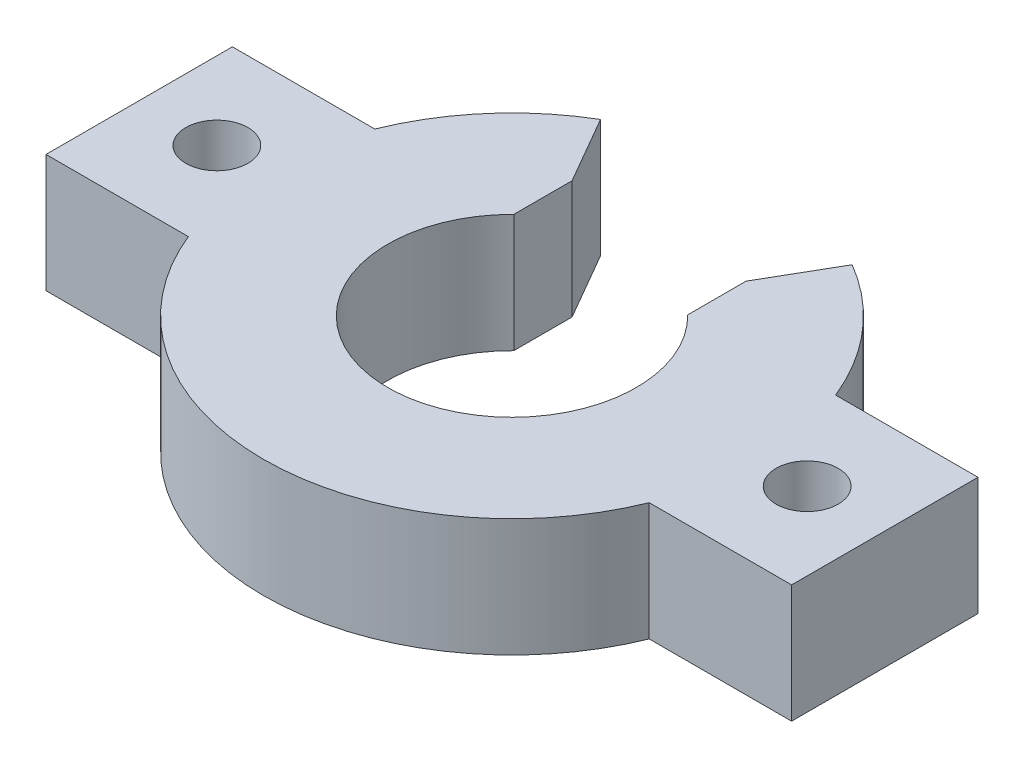
ISO-10303-21;
HEADER;
FILE_DESCRIPTION(('STEP AP214'),'2;1');
FILE_NAME('part.step','',(''),(''),'','','');
FILE_SCHEMA(('AUTOMOTIVE_DESIGN { 1 0 10303 214 1 1 1 1 }'));
ENDSEC;
DATA;
#1=APPLICATION_CONTEXT('core data for automotive mechanical design processes');
#2=APPLICATION_PROTOCOL_DEFINITION('international standard','automotive_design',2000,#1);
#3=PRODUCT_CONTEXT('',#1,'mechanical');
#4=PRODUCT('Part','Part','',(#3));
#5=PRODUCT_RELATED_PRODUCT_CATEGORY('part','',(#4));
#6=PRODUCT_DEFINITION_FORMATION('','',#4);
#7=PRODUCT_DEFINITION_CONTEXT('part definition',#1,'design');
#8=PRODUCT_DEFINITION('design','',#6,#7);
#9=PRODUCT_DEFINITION_SHAPE('','',#8);
#10=(LENGTH_UNIT() NAMED_UNIT(*) SI_UNIT(.MILLI.,.METRE.));
#11=(NAMED_UNIT(*) PLANE_ANGLE_UNIT() SI_UNIT($,.RADIAN.));
#12=(NAMED_UNIT(*) SI_UNIT($,.STERADIAN.) SOLID_ANGLE_UNIT());
#13=UNCERTAINTY_MEASURE_WITH_UNIT(LENGTH_MEASURE(1.E-05),#10,'distance_accuracy_value','');
#14=(GEOMETRIC_REPRESENTATION_CONTEXT(3) GLOBAL_UNCERTAINTY_ASSIGNED_CONTEXT((#13)) GLOBAL_UNIT_ASSIGNED_CONTEXT((#10,
#11,#12)) REPRESENTATION_CONTEXT('',''));
#15=CARTESIAN_POINT('',(0.,0.,0.));
#16=DIRECTION('',(0.,0.,1.));
#17=DIRECTION('',(1.,0.,0.));
#18=AXIS2_PLACEMENT_3D('',#15,#16,#17);
#19=CARTESIAN_POINT('',(0.,3.8,0.));
#20=DIRECTION('',(0.,-1.,0.));
#21=DIRECTION('',(0.,0.,-1.));
#22=AXIS2_PLACEMENT_3D('',#19,#20,#21);
#23=CYLINDRICAL_SURFACE('',#22,8.);
#24=CARTESIAN_POINT('',(0.,0.,0.));
#25=DIRECTION('',(0.,1.,0.));
#26=DIRECTION('',(0.,0.,1.));
#27=AXIS2_PLACEMENT_3D('',#24,#25,#26);
#28=CIRCLE('',#27,8.);
#29=CARTESIAN_POINT('',(7.41619848709566,0.,-3.));
#30=VERTEX_POINT('',#29);
#31=CARTESIAN_POINT('',(4.05,0.,-6.89909414343651));
#32=VERTEX_POINT('',#31);
#33=EDGE_CURVE('E162',#30,#32,#28,.T.);
#34=ORIENTED_EDGE('',*,*,#33,.T.);
#35=DIRECTION('',(0.,1.,0.));
#36=VECTOR('',#35,1.);
#37=CARTESIAN_POINT('',(4.05,0.,-6.89909414343651));
#38=LINE('',#37,#36);
#39=CARTESIAN_POINT('',(4.05,3.8,-6.89909414343651));
#40=VERTEX_POINT('',#39);
#41=EDGE_CURVE('E254',#32,#40,#38,.T.);
#42=ORIENTED_EDGE('',*,*,#41,.T.);
#43=CARTESIAN_POINT('',(0.,3.8,0.));
#44=DIRECTION('',(0.,1.,0.));
#45=DIRECTION('',(0.,0.,1.));
#46=AXIS2_PLACEMENT_3D('',#43,#44,#45);
#47=CIRCLE('',#46,8.);
#48=CARTESIAN_POINT('',(7.41619848709566,3.8,-3.));
#49=VERTEX_POINT('',#48);
#50=EDGE_CURVE('E175',#49,#40,#47,.T.);
#51=ORIENTED_EDGE('',*,*,#50,.F.);
#52=DIRECTION('',(0.,-1.,0.));
#53=VECTOR('',#52,1.);
#54=CARTESIAN_POINT('',(7.41619848709566,3.8,-3.));
#55=LINE('',#54,#53);
#56=EDGE_CURVE('E45',#49,#30,#55,.T.);
#57=ORIENTED_EDGE('',*,*,#56,.T.);
#58=EDGE_LOOP('',(#34,#42,#51,#57));
#59=FACE_BOUND('',#58,.T.);
#60=ADVANCED_FACE('F37',(#59),#23,.T.);
#61=CARTESIAN_POINT('',(-7.41619848709566,0.,3.));
#62=VERTEX_POINT('',#61);
#63=CARTESIAN_POINT('',(7.41619848709566,0.,3.));
#64=VERTEX_POINT('',#63);
#65=EDGE_CURVE('E165',#62,#64,#28,.T.);
#66=ORIENTED_EDGE('',*,*,#65,.T.);
#67=DIRECTION('',(0.,-1.,0.));
#68=VECTOR('',#67,1.);
#69=CARTESIAN_POINT('',(7.41619848709566,3.8,3.));
#70=LINE('',#69,#68);
#71=CARTESIAN_POINT('',(7.41619848709566,3.8,3.));
#72=VERTEX_POINT('',#71);
#73=EDGE_CURVE('E11',#64,#72,#70,.F.);
#74=ORIENTED_EDGE('',*,*,#73,.T.);
#75=CARTESIAN_POINT('',(-7.41619848709566,3.8,3.));
#76=VERTEX_POINT('',#75);
#77=EDGE_CURVE('E176',#76,#72,#47,.T.);
#78=ORIENTED_EDGE('',*,*,#77,.F.);
#79=DIRECTION('',(0.,-1.,0.));
#80=VECTOR('',#79,1.);
#81=CARTESIAN_POINT('',(-7.41619848709566,3.8,3.));
#82=LINE('',#81,#80);
#83=EDGE_CURVE('E181',#76,#62,#82,.T.);
#84=ORIENTED_EDGE('',*,*,#83,.T.);
#85=EDGE_LOOP('',(#66,#74,#78,#84));
#86=FACE_BOUND('',#85,.T.);
#87=ADVANCED_FACE('F297',(#86),#23,.T.);
#88=CARTESIAN_POINT('',(0.,3.8,0.));
#89=DIRECTION('',(0.,1.,0.));
#90=DIRECTION('',(0.,0.,1.));
#91=AXIS2_PLACEMENT_3D('',#88,#89,#90);
#92=PLANE('',#91);
#93=DIRECTION('',(0.5,0.,-0.866025403784438));
#94=VECTOR('',#93,1.);
#95=CARTESIAN_POINT('',(4.05,3.8,-6.89909414343651));
#96=LINE('',#95,#94);
#97=CARTESIAN_POINT('',(2.8,3.8,-4.73403063397542));
#98=VERTEX_POINT('',#97);
#99=EDGE_CURVE('E148',#98,#40,#96,.T.);
#100=ORIENTED_EDGE('',*,*,#99,.F.);
#101=DIRECTION('',(0.,0.,-1.));
#102=VECTOR('',#101,1.);
#103=CARTESIAN_POINT('',(2.8,3.8,-4.73403063397542));
#104=LINE('',#103,#102);
#105=CARTESIAN_POINT('',(2.8,3.8,-2.85657137141714));
#106=VERTEX_POINT('',#105);
#107=EDGE_CURVE('E475',#106,#98,#104,.T.);
#108=ORIENTED_EDGE('',*,*,#107,.F.);
#109=CARTESIAN_POINT('',(0.,3.8,0.));
#110=DIRECTION('',(0.,1.,0.));
#111=DIRECTION('',(0.,0.,1.));
#112=AXIS2_PLACEMENT_3D('',#109,#110,#111);
#113=CIRCLE('',#112,4.);
#114=CARTESIAN_POINT('',(-2.8,3.8,-2.85657137141714));
#115=VERTEX_POINT('',#114);
#116=EDGE_CURVE('E163',#115,#106,#113,.T.);
#117=ORIENTED_EDGE('',*,*,#116,.F.);
#118=DIRECTION('',(0.,0.,1.));
#119=VECTOR('',#118,1.);
#120=CARTESIAN_POINT('',(-2.8,3.8,-4.73403063397542));
#121=LINE('',#120,#119);
#122=CARTESIAN_POINT('',(-2.8,3.8,-4.73403063397542));
#123=VERTEX_POINT('',#122);
#124=EDGE_CURVE('E60',#123,#115,#121,.T.);
#125=ORIENTED_EDGE('',*,*,#124,.F.);
#126=DIRECTION('',(0.500000000000001,0.,0.866025403784438));
#127=VECTOR('',#126,1.);
#128=CARTESIAN_POINT('',(-4.05,3.8,-6.89909414343651));
#129=LINE('',#128,#127);
#130=CARTESIAN_POINT('',(-4.05,3.8,-6.89909414343651));
#131=VERTEX_POINT('',#130);
#132=EDGE_CURVE('E486',#131,#123,#129,.T.);
#133=ORIENTED_EDGE('',*,*,#132,.F.);
#134=CARTESIAN_POINT('',(-7.41619848709566,3.8,-3.));
#135=VERTEX_POINT('',#134);
#136=EDGE_CURVE('E155',#131,#135,#47,.T.);
#137=ORIENTED_EDGE('',*,*,#136,.T.);
#138=DIRECTION('',(-1.,0.,0.));
#139=VECTOR('',#138,1.);
#140=CARTESIAN_POINT('',(-12.,3.8,-3.));
#141=LINE('',#140,#139);
#142=CARTESIAN_POINT('',(-12.,3.8,-3.));
#143=VERTEX_POINT('',#142);
#144=EDGE_CURVE('E236',#135,#143,#141,.T.);
#145=ORIENTED_EDGE('',*,*,#144,.T.);
#146=DIRECTION('',(0.,0.,1.));
#147=VECTOR('',#146,1.);
#148=CARTESIAN_POINT('',(-12.,3.8,-3.));
#149=LINE('',#148,#147);
#150=CARTESIAN_POINT('',(-12.,3.8,3.));
#151=VERTEX_POINT('',#150);
#152=EDGE_CURVE('E223',#143,#151,#149,.T.);
#153=ORIENTED_EDGE('',*,*,#152,.T.);
#154=DIRECTION('',(1.,0.,0.));
#155=VECTOR('',#154,1.);
#156=CARTESIAN_POINT('',(-12.,3.8,3.));
#157=LINE('',#156,#155);
#158=EDGE_CURVE('E234',#151,#76,#157,.T.);
#159=ORIENTED_EDGE('',*,*,#158,.T.);
#160=ORIENTED_EDGE('',*,*,#77,.T.);
#161=DIRECTION('',(1.,0.,0.));
#162=VECTOR('',#161,1.);
#163=CARTESIAN_POINT('',(12.,3.8,3.));
#164=LINE('',#163,#162);
#165=CARTESIAN_POINT('',(12.,3.8,3.));
#166=VERTEX_POINT('',#165);
#167=EDGE_CURVE('E214',#72,#166,#164,.T.);
#168=ORIENTED_EDGE('',*,*,#167,.T.);
#169=DIRECTION('',(0.,0.,-1.));
#170=VECTOR('',#169,1.);
#171=CARTESIAN_POINT('',(12.,3.8,-3.));
#172=LINE('',#171,#170);
#173=CARTESIAN_POINT('',(12.,3.8,-3.));
#174=VERTEX_POINT('',#173);
#175=EDGE_CURVE('E221',#166,#174,#172,.T.);
#176=ORIENTED_EDGE('',*,*,#175,.T.);
#177=DIRECTION('',(-1.,0.,0.));
#178=VECTOR('',#177,1.);
#179=CARTESIAN_POINT('',(12.,3.8,-3.));
#180=LINE('',#179,#178);
#181=EDGE_CURVE('E219',#174,#49,#180,.T.);
#182=ORIENTED_EDGE('',*,*,#181,.T.);
#183=ORIENTED_EDGE('',*,*,#50,.T.);
#184=EDGE_LOOP('',(#100,#108,#117,#125,#133,#137,#145,#153,#159,#160,#168,#176,#182,#183));
#185=FACE_BOUND('',#184,.T.);
#186=CARTESIAN_POINT('',(-9.5,3.8,0.));
#187=DIRECTION('',(0.,-1.,0.));
#188=DIRECTION('',(0.,0.,-1.));
#189=AXIS2_PLACEMENT_3D('',#186,#187,#188);
#190=CIRCLE('',#189,1.);
#191=CARTESIAN_POINT('',(-9.5,3.8,-1.));
#192=VERTEX_POINT('',#191);
#193=EDGE_CURVE('E260',#192,#192,#190,.T.);
#194=ORIENTED_EDGE('',*,*,#193,.T.);
#195=EDGE_LOOP('',(#194));
#196=FACE_BOUND('',#195,.T.);
#197=CARTESIAN_POINT('',(9.5,3.8,0.));
#198=DIRECTION('',(0.,-1.,0.));
#199=DIRECTION('',(0.,0.,1.));
#200=AXIS2_PLACEMENT_3D('',#197,#198,#199);
#201=CIRCLE('',#200,1.);
#202=CARTESIAN_POINT('',(9.5,3.8,1.));
#203=VERTEX_POINT('',#202);
#204=EDGE_CURVE('E269',#203,#203,#201,.T.);
#205=ORIENTED_EDGE('',*,*,#204,.T.);
#206=EDGE_LOOP('',(#205));
#207=FACE_BOUND('',#206,.T.);
#208=ADVANCED_FACE('F301',(#185,#196,#207),#92,.T.);
#209=CARTESIAN_POINT('',(0.,0.,0.));
#210=DIRECTION('',(0.,1.,0.));
#211=DIRECTION('',(0.,0.,1.));
#212=AXIS2_PLACEMENT_3D('',#209,#210,#211);
#213=PLANE('',#212);
#214=CARTESIAN_POINT('',(-9.5,0.,0.));
#215=DIRECTION('',(0.,-1.,0.));
#216=DIRECTION('',(0.,0.,-1.));
#217=AXIS2_PLACEMENT_3D('',#214,#215,#216);
#218=CIRCLE('',#217,2.);
#219=CARTESIAN_POINT('',(-9.5,0.,-2.));
#220=VERTEX_POINT('',#219);
#221=EDGE_CURVE('E207',#220,#220,#218,.T.);
#222=ORIENTED_EDGE('',*,*,#221,.F.);
#223=EDGE_LOOP('',(#222));
#224=FACE_BOUND('',#223,.T.);
#225=CARTESIAN_POINT('',(9.5,0.,0.));
#226=DIRECTION('',(0.,-1.,0.));
#227=DIRECTION('',(0.,0.,1.));
#228=AXIS2_PLACEMENT_3D('',#225,#226,#227);
#229=CIRCLE('',#228,2.);
#230=CARTESIAN_POINT('',(9.5,0.,2.));
#231=VERTEX_POINT('',#230);
#232=EDGE_CURVE('E273',#231,#231,#229,.T.);
#233=ORIENTED_EDGE('',*,*,#232,.F.);
#234=EDGE_LOOP('',(#233));
#235=FACE_BOUND('',#234,.T.);
#236=DIRECTION('',(0.,0.,-1.));
#237=VECTOR('',#236,1.);
#238=CARTESIAN_POINT('',(2.8,0.,-4.73403063397542));
#239=LINE('',#238,#237);
#240=CARTESIAN_POINT('',(2.8,0.,-2.85657137141714));
#241=VERTEX_POINT('',#240);
#242=CARTESIAN_POINT('',(2.8,0.,-4.73403063397542));
#243=VERTEX_POINT('',#242);
#244=EDGE_CURVE('E52',#241,#243,#239,.T.);
#245=ORIENTED_EDGE('',*,*,#244,.T.);
#246=DIRECTION('',(0.5,0.,-0.866025403784438));
#247=VECTOR('',#246,1.);
#248=CARTESIAN_POINT('',(4.05,0.,-6.89909414343651));
#249=LINE('',#248,#247);
#250=EDGE_CURVE('E156',#243,#32,#249,.T.);
#251=ORIENTED_EDGE('',*,*,#250,.T.);
#252=ORIENTED_EDGE('',*,*,#33,.F.);
#253=DIRECTION('',(1.,0.,0.));
#254=VECTOR('',#253,1.);
#255=CARTESIAN_POINT('',(12.,0.,-3.));
#256=LINE('',#255,#254);
#257=CARTESIAN_POINT('',(12.,0.,-3.));
#258=VERTEX_POINT('',#257);
#259=EDGE_CURVE('E197',#30,#258,#256,.T.);
#260=ORIENTED_EDGE('',*,*,#259,.T.);
#261=DIRECTION('',(0.,0.,1.));
#262=VECTOR('',#261,1.);
#263=CARTESIAN_POINT('',(12.,0.,-3.));
#264=LINE('',#263,#262);
#265=CARTESIAN_POINT('',(12.,0.,3.));
#266=VERTEX_POINT('',#265);
#267=EDGE_CURVE('E201',#258,#266,#264,.T.);
#268=ORIENTED_EDGE('',*,*,#267,.T.);
#269=DIRECTION('',(-1.,0.,0.));
#270=VECTOR('',#269,1.);
#271=CARTESIAN_POINT('',(12.,0.,3.));
#272=LINE('',#271,#270);
#273=EDGE_CURVE('E204',#266,#64,#272,.T.);
#274=ORIENTED_EDGE('',*,*,#273,.T.);
#275=ORIENTED_EDGE('',*,*,#65,.F.);
#276=DIRECTION('',(-1.,0.,0.));
#277=VECTOR('',#276,1.);
#278=CARTESIAN_POINT('',(-12.,0.,3.));
#279=LINE('',#278,#277);
#280=CARTESIAN_POINT('',(-12.,0.,3.));
#281=VERTEX_POINT('',#280);
#282=EDGE_CURVE('E231',#62,#281,#279,.T.);
#283=ORIENTED_EDGE('',*,*,#282,.T.);
#284=DIRECTION('',(0.,0.,-1.));
#285=VECTOR('',#284,1.);
#286=CARTESIAN_POINT('',(-12.,0.,-3.));
#287=LINE('',#286,#285);
#288=CARTESIAN_POINT('',(-12.,0.,-3.));
#289=VERTEX_POINT('',#288);
#290=EDGE_CURVE('E228',#281,#289,#287,.T.);
#291=ORIENTED_EDGE('',*,*,#290,.T.);
#292=DIRECTION('',(1.,0.,0.));
#293=VECTOR('',#292,1.);
#294=CARTESIAN_POINT('',(-12.,0.,-3.));
#295=LINE('',#294,#293);
#296=CARTESIAN_POINT('',(-7.41619848709566,0.,-3.));
#297=VERTEX_POINT('',#296);
#298=EDGE_CURVE('E161',#289,#297,#295,.T.);
#299=ORIENTED_EDGE('',*,*,#298,.T.);
#300=CARTESIAN_POINT('',(-4.05,0.,-6.89909414343651));
#301=VERTEX_POINT('',#300);
#302=EDGE_CURVE('E153',#301,#297,#28,.T.);
#303=ORIENTED_EDGE('',*,*,#302,.F.);
#304=DIRECTION('',(0.500000000000001,0.,0.866025403784438));
#305=VECTOR('',#304,1.);
#306=CARTESIAN_POINT('',(-4.05,0.,-6.89909414343651));
#307=LINE('',#306,#305);
#308=CARTESIAN_POINT('',(-2.8,0.,-4.73403063397542));
#309=VERTEX_POINT('',#308);
#310=EDGE_CURVE('E136',#301,#309,#307,.T.);
#311=ORIENTED_EDGE('',*,*,#310,.T.);
#312=DIRECTION('',(0.,0.,1.));
#313=VECTOR('',#312,1.);
#314=CARTESIAN_POINT('',(-2.8,0.,-4.73403063397542));
#315=LINE('',#314,#313);
#316=CARTESIAN_POINT('',(-2.8,0.,-2.85657137141714));
#317=VERTEX_POINT('',#316);
#318=EDGE_CURVE('E147',#309,#317,#315,.T.);
#319=ORIENTED_EDGE('',*,*,#318,.T.);
#320=CARTESIAN_POINT('',(0.,0.,0.));
#321=DIRECTION('',(0.,1.,0.));
#322=DIRECTION('',(0.,0.,1.));
#323=AXIS2_PLACEMENT_3D('',#320,#321,#322);
#324=CIRCLE('',#323,4.);
#325=EDGE_CURVE('E168',#317,#241,#324,.T.);
#326=ORIENTED_EDGE('',*,*,#325,.T.);
#327=EDGE_LOOP('',(#245,#251,#252,#260,#268,#274,#275,#283,#291,#299,#303,#311,#319,#326));
#328=FACE_BOUND('',#327,.T.);
#329=ADVANCED_FACE('F159',(#224,#235,#328),#213,.F.);
#330=ORIENTED_EDGE('',*,*,#136,.F.);
#331=DIRECTION('',(0.,1.,0.));
#332=VECTOR('',#331,1.);
#333=CARTESIAN_POINT('',(-4.05,0.,-6.89909414343651));
#334=LINE('',#333,#332);
#335=EDGE_CURVE('E140',#301,#131,#334,.T.);
#336=ORIENTED_EDGE('',*,*,#335,.F.);
#337=ORIENTED_EDGE('',*,*,#302,.T.);
#338=DIRECTION('',(0.,-1.,0.));
#339=VECTOR('',#338,1.);
#340=CARTESIAN_POINT('',(-7.41619848709566,3.8,-3.));
#341=LINE('',#340,#339);
#342=EDGE_CURVE('E184',#297,#135,#341,.F.);
#343=ORIENTED_EDGE('',*,*,#342,.T.);
#344=EDGE_LOOP('',(#330,#336,#337,#343));
#345=FACE_BOUND('',#344,.T.);
#346=ADVANCED_FACE('F39',(#345),#23,.T.);
#347=CARTESIAN_POINT('',(0.,3.8,0.));
#348=DIRECTION('',(0.,-1.,0.));
#349=DIRECTION('',(0.,0.,-1.));
#350=AXIS2_PLACEMENT_3D('',#347,#348,#349);
#351=CYLINDRICAL_SURFACE('',#350,4.);
#352=DIRECTION('',(0.,1.,0.));
#353=VECTOR('',#352,1.);
#354=CARTESIAN_POINT('',(2.8,0.,-2.85657137141714));
#355=LINE('',#354,#353);
#356=EDGE_CURVE('E249',#241,#106,#355,.T.);
#357=ORIENTED_EDGE('',*,*,#356,.F.);
#358=ORIENTED_EDGE('',*,*,#325,.F.);
#359=DIRECTION('',(0.,1.,0.));
#360=VECTOR('',#359,1.);
#361=CARTESIAN_POINT('',(-2.8,0.,-2.85657137141714));
#362=LINE('',#361,#360);
#363=EDGE_CURVE('E247',#317,#115,#362,.T.);
#364=ORIENTED_EDGE('',*,*,#363,.T.);
#365=ORIENTED_EDGE('',*,*,#116,.T.);
#366=EDGE_LOOP('',(#357,#358,#364,#365));
#367=FACE_BOUND('',#366,.T.);
#368=ADVANCED_FACE('F246',(#367),#351,.F.);
#369=CARTESIAN_POINT('',(-12.,-8.48528137423857,-3.));
#370=DIRECTION('',(0.,0.,-1.));
#371=DIRECTION('',(-1.,0.,0.));
#372=AXIS2_PLACEMENT_3D('',#369,#370,#371);
#373=PLANE('',#372);
#374=ORIENTED_EDGE('',*,*,#342,.F.);
#375=ORIENTED_EDGE('',*,*,#298,.F.);
#376=DIRECTION('',(0.,1.,0.));
#377=VECTOR('',#376,1.);
#378=CARTESIAN_POINT('',(-12.,-8.48528137423857,-3.));
#379=LINE('',#378,#377);
#380=EDGE_CURVE('E229',#289,#143,#379,.T.);
#381=ORIENTED_EDGE('',*,*,#380,.T.);
#382=ORIENTED_EDGE('',*,*,#144,.F.);
#383=EDGE_LOOP('',(#374,#375,#381,#382));
#384=FACE_BOUND('',#383,.T.);
#385=ADVANCED_FACE('F307',(#384),#373,.T.);
#386=CARTESIAN_POINT('',(-12.,-8.48528137423857,3.));
#387=DIRECTION('',(0.,0.,1.));
#388=DIRECTION('',(1.,0.,0.));
#389=AXIS2_PLACEMENT_3D('',#386,#387,#388);
#390=PLANE('',#389);
#391=ORIENTED_EDGE('',*,*,#83,.F.);
#392=ORIENTED_EDGE('',*,*,#158,.F.);
#393=DIRECTION('',(0.,1.,0.));
#394=VECTOR('',#393,1.);
#395=CARTESIAN_POINT('',(-12.,-8.48528137423857,3.));
#396=LINE('',#395,#394);
#397=EDGE_CURVE('E238',#281,#151,#396,.T.);
#398=ORIENTED_EDGE('',*,*,#397,.F.);
#399=ORIENTED_EDGE('',*,*,#282,.F.);
#400=EDGE_LOOP('',(#391,#392,#398,#399));
#401=FACE_BOUND('',#400,.T.);
#402=ADVANCED_FACE('F321',(#401),#390,.T.);
#403=CARTESIAN_POINT('',(-12.,-8.48528137423857,-3.));
#404=DIRECTION('',(-1.,0.,0.));
#405=DIRECTION('',(0.,0.,1.));
#406=AXIS2_PLACEMENT_3D('',#403,#404,#405);
#407=PLANE('',#406);
#408=ORIENTED_EDGE('',*,*,#290,.F.);
#409=ORIENTED_EDGE('',*,*,#397,.T.);
#410=ORIENTED_EDGE('',*,*,#152,.F.);
#411=ORIENTED_EDGE('',*,*,#380,.F.);
#412=EDGE_LOOP('',(#408,#409,#410,#411));
#413=FACE_BOUND('',#412,.T.);
#414=ADVANCED_FACE('F317',(#413),#407,.T.);
#415=CARTESIAN_POINT('',(12.,-8.48528137423857,3.));
#416=DIRECTION('',(0.,0.,1.));
#417=DIRECTION('',(1.,0.,0.));
#418=AXIS2_PLACEMENT_3D('',#415,#416,#417);
#419=PLANE('',#418);
#420=ORIENTED_EDGE('',*,*,#73,.F.);
#421=ORIENTED_EDGE('',*,*,#273,.F.);
#422=DIRECTION('',(0.,1.,0.));
#423=VECTOR('',#422,1.);
#424=CARTESIAN_POINT('',(12.,-8.48528137423857,3.));
#425=LINE('',#424,#423);
#426=EDGE_CURVE('E215',#266,#166,#425,.T.);
#427=ORIENTED_EDGE('',*,*,#426,.T.);
#428=ORIENTED_EDGE('',*,*,#167,.F.);
#429=EDGE_LOOP('',(#420,#421,#427,#428));
#430=FACE_BOUND('',#429,.T.);
#431=ADVANCED_FACE('F320',(#430),#419,.T.);
#432=CARTESIAN_POINT('',(12.,-8.48528137423857,-3.));
#433=DIRECTION('',(0.,0.,-1.));
#434=DIRECTION('',(-1.,0.,0.));
#435=AXIS2_PLACEMENT_3D('',#432,#433,#434);
#436=PLANE('',#435);
#437=ORIENTED_EDGE('',*,*,#56,.F.);
#438=ORIENTED_EDGE('',*,*,#181,.F.);
#439=DIRECTION('',(0.,1.,0.));
#440=VECTOR('',#439,1.);
#441=CARTESIAN_POINT('',(12.,-8.48528137423857,-3.));
#442=LINE('',#441,#440);
#443=EDGE_CURVE('E199',#258,#174,#442,.T.);
#444=ORIENTED_EDGE('',*,*,#443,.F.);
#445=ORIENTED_EDGE('',*,*,#259,.F.);
#446=EDGE_LOOP('',(#437,#438,#444,#445));
#447=FACE_BOUND('',#446,.T.);
#448=ADVANCED_FACE('F198',(#447),#436,.T.);
#449=CARTESIAN_POINT('',(12.,-8.48528137423857,-3.));
#450=DIRECTION('',(1.,0.,0.));
#451=DIRECTION('',(0.,0.,-1.));
#452=AXIS2_PLACEMENT_3D('',#449,#450,#451);
#453=PLANE('',#452);
#454=ORIENTED_EDGE('',*,*,#267,.F.);
#455=ORIENTED_EDGE('',*,*,#443,.T.);
#456=ORIENTED_EDGE('',*,*,#175,.F.);
#457=ORIENTED_EDGE('',*,*,#426,.F.);
#458=EDGE_LOOP('',(#454,#455,#456,#457));
#459=FACE_BOUND('',#458,.T.);
#460=ADVANCED_FACE('F284',(#459),#453,.T.);
#461=CARTESIAN_POINT('',(9.5,1.,0.));
#462=DIRECTION('',(0.,-1.,0.));
#463=DIRECTION('',(0.,0.,-1.));
#464=AXIS2_PLACEMENT_3D('',#461,#462,#463);
#465=CYLINDRICAL_SURFACE('',#464,2.);
#466=CARTESIAN_POINT('',(9.5,1.,0.));
#467=DIRECTION('',(0.,-1.,0.));
#468=DIRECTION('',(0.,0.,1.));
#469=AXIS2_PLACEMENT_3D('',#466,#467,#468);
#470=CIRCLE('',#469,2.);
#471=CARTESIAN_POINT('',(9.5,1.,2.));
#472=VERTEX_POINT('',#471);
#473=EDGE_CURVE('E211',#472,#472,#470,.T.);
#474=ORIENTED_EDGE('',*,*,#473,.F.);
#475=EDGE_LOOP('',(#474));
#476=FACE_BOUND('',#475,.T.);
#477=ORIENTED_EDGE('',*,*,#232,.T.);
#478=EDGE_LOOP('',(#477));
#479=FACE_BOUND('',#478,.T.);
#480=ADVANCED_FACE('F282',(#476,#479),#465,.F.);
#481=CARTESIAN_POINT('',(9.5,1.,0.));
#482=DIRECTION('',(0.,1.,0.));
#483=DIRECTION('',(0.,0.,1.));
#484=AXIS2_PLACEMENT_3D('',#481,#482,#483);
#485=PLANE('',#484);
#486=CARTESIAN_POINT('',(9.5,1.,0.));
#487=DIRECTION('',(0.,-1.,0.));
#488=DIRECTION('',(0.,0.,1.));
#489=AXIS2_PLACEMENT_3D('',#486,#487,#488);
#490=CIRCLE('',#489,1.);
#491=CARTESIAN_POINT('',(9.5,1.,1.));
#492=VERTEX_POINT('',#491);
#493=EDGE_CURVE('E266',#492,#492,#490,.T.);
#494=ORIENTED_EDGE('',*,*,#493,.F.);
#495=EDGE_LOOP('',(#494));
#496=FACE_BOUND('',#495,.T.);
#497=ORIENTED_EDGE('',*,*,#473,.T.);
#498=EDGE_LOOP('',(#497));
#499=FACE_BOUND('',#498,.T.);
#500=ADVANCED_FACE('F280',(#496,#499),#485,.F.);
#501=CARTESIAN_POINT('',(-9.5,1.,0.));
#502=DIRECTION('',(0.,-1.,0.));
#503=DIRECTION('',(0.,0.,-1.));
#504=AXIS2_PLACEMENT_3D('',#501,#502,#503);
#505=CYLINDRICAL_SURFACE('',#504,2.);
#506=CARTESIAN_POINT('',(-9.5,1.,0.));
#507=DIRECTION('',(0.,-1.,0.));
#508=DIRECTION('',(0.,0.,-1.));
#509=AXIS2_PLACEMENT_3D('',#506,#507,#508);
#510=CIRCLE('',#509,2.);
#511=CARTESIAN_POINT('',(-9.5,1.,-2.));
#512=VERTEX_POINT('',#511);
#513=EDGE_CURVE('E202',#512,#512,#510,.T.);
#514=ORIENTED_EDGE('',*,*,#513,.F.);
#515=EDGE_LOOP('',(#514));
#516=FACE_BOUND('',#515,.T.);
#517=ORIENTED_EDGE('',*,*,#221,.T.);
#518=EDGE_LOOP('',(#517));
#519=FACE_BOUND('',#518,.T.);
#520=ADVANCED_FACE('F290',(#516,#519),#505,.F.);
#521=CARTESIAN_POINT('',(-9.5,1.,0.));
#522=DIRECTION('',(0.,-1.,0.));
#523=DIRECTION('',(0.,0.,-1.));
#524=AXIS2_PLACEMENT_3D('',#521,#522,#523);
#525=PLANE('',#524);
#526=CARTESIAN_POINT('',(-9.5,1.,0.));
#527=DIRECTION('',(0.,-1.,0.));
#528=DIRECTION('',(0.,0.,-1.));
#529=AXIS2_PLACEMENT_3D('',#526,#527,#528);
#530=CIRCLE('',#529,1.);
#531=CARTESIAN_POINT('',(-9.5,1.,-1.));
#532=VERTEX_POINT('',#531);
#533=EDGE_CURVE('E263',#532,#532,#530,.T.);
#534=ORIENTED_EDGE('',*,*,#533,.F.);
#535=EDGE_LOOP('',(#534));
#536=FACE_BOUND('',#535,.T.);
#537=ORIENTED_EDGE('',*,*,#513,.T.);
#538=EDGE_LOOP('',(#537));
#539=FACE_BOUND('',#538,.T.);
#540=ADVANCED_FACE('F357',(#536,#539),#525,.T.);
#541=CARTESIAN_POINT('',(9.5,3.8,0.));
#542=DIRECTION('',(0.,-1.,0.));
#543=DIRECTION('',(0.,0.,-1.));
#544=AXIS2_PLACEMENT_3D('',#541,#542,#543);
#545=CYLINDRICAL_SURFACE('',#544,1.);
#546=ORIENTED_EDGE('',*,*,#204,.F.);
#547=EDGE_LOOP('',(#546));
#548=FACE_BOUND('',#547,.T.);
#549=ORIENTED_EDGE('',*,*,#493,.T.);
#550=EDGE_LOOP('',(#549));
#551=FACE_BOUND('',#550,.T.);
#552=ADVANCED_FACE('F373',(#548,#551),#545,.F.);
#553=CARTESIAN_POINT('',(-9.5,3.8,0.));
#554=DIRECTION('',(0.,-1.,0.));
#555=DIRECTION('',(0.,0.,-1.));
#556=AXIS2_PLACEMENT_3D('',#553,#554,#555);
#557=CYLINDRICAL_SURFACE('',#556,1.);
#558=ORIENTED_EDGE('',*,*,#193,.F.);
#559=EDGE_LOOP('',(#558));
#560=FACE_BOUND('',#559,.T.);
#561=ORIENTED_EDGE('',*,*,#533,.T.);
#562=EDGE_LOOP('',(#561));
#563=FACE_BOUND('',#562,.T.);
#564=ADVANCED_FACE('F384',(#560,#563),#557,.F.);
#565=CARTESIAN_POINT('',(-2.8,0.,-4.73403063397542));
#566=DIRECTION('',(-1.,0.,0.));
#567=DIRECTION('',(0.,0.,1.));
#568=AXIS2_PLACEMENT_3D('',#565,#566,#567);
#569=PLANE('',#568);
#570=ORIENTED_EDGE('',*,*,#124,.T.);
#571=ORIENTED_EDGE('',*,*,#363,.F.);
#572=ORIENTED_EDGE('',*,*,#318,.F.);
#573=DIRECTION('',(0.,1.,0.));
#574=VECTOR('',#573,1.);
#575=CARTESIAN_POINT('',(-2.8,0.,-4.73403063397542));
#576=LINE('',#575,#574);
#577=EDGE_CURVE('E142',#309,#123,#576,.T.);
#578=ORIENTED_EDGE('',*,*,#577,.T.);
#579=EDGE_LOOP('',(#570,#571,#572,#578));
#580=FACE_BOUND('',#579,.T.);
#581=ADVANCED_FACE('F394',(#580),#569,.F.);
#582=CARTESIAN_POINT('',(-4.05,0.,-6.89909414343651));
#583=DIRECTION('',(-0.866025403784438,0.,0.500000000000001));
#584=DIRECTION('',(0.500000000000001,0.,0.866025403784438));
#585=AXIS2_PLACEMENT_3D('',#582,#583,#584);
#586=PLANE('',#585);
#587=ORIENTED_EDGE('',*,*,#132,.T.);
#588=ORIENTED_EDGE('',*,*,#577,.F.);
#589=ORIENTED_EDGE('',*,*,#310,.F.);
#590=ORIENTED_EDGE('',*,*,#335,.T.);
#591=EDGE_LOOP('',(#587,#588,#589,#590));
#592=FACE_BOUND('',#591,.T.);
#593=ADVANCED_FACE('F139',(#592),#586,.F.);
#594=CARTESIAN_POINT('',(4.05,0.,-6.89909414343651));
#595=DIRECTION('',(0.866025403784439,0.,0.5));
#596=DIRECTION('',(0.5,0.,-0.866025403784439));
#597=AXIS2_PLACEMENT_3D('',#594,#595,#596);
#598=PLANE('',#597);
#599=ORIENTED_EDGE('',*,*,#99,.T.);
#600=ORIENTED_EDGE('',*,*,#41,.F.);
#601=ORIENTED_EDGE('',*,*,#250,.F.);
#602=DIRECTION('',(0.,1.,0.));
#603=VECTOR('',#602,1.);
#604=CARTESIAN_POINT('',(2.8,0.,-4.73403063397542));
#605=LINE('',#604,#603);
#606=EDGE_CURVE('E252',#243,#98,#605,.T.);
#607=ORIENTED_EDGE('',*,*,#606,.T.);
#608=EDGE_LOOP('',(#599,#600,#601,#607));
#609=FACE_BOUND('',#608,.T.);
#610=ADVANCED_FACE('F446',(#609),#598,.F.);
#611=CARTESIAN_POINT('',(2.8,0.,-4.73403063397542));
#612=DIRECTION('',(1.,0.,0.));
#613=DIRECTION('',(0.,0.,-1.));
#614=AXIS2_PLACEMENT_3D('',#611,#612,#613);
#615=PLANE('',#614);
#616=ORIENTED_EDGE('',*,*,#107,.T.);
#617=ORIENTED_EDGE('',*,*,#606,.F.);
#618=ORIENTED_EDGE('',*,*,#244,.F.);
#619=ORIENTED_EDGE('',*,*,#356,.T.);
#620=EDGE_LOOP('',(#616,#617,#618,#619));
#621=FACE_BOUND('',#620,.T.);
#622=ADVANCED_FACE('F456',(#621),#615,.F.);
#623=CLOSED_SHELL('',(#60,#87,#208,#329,#346,#368,#385,#402,#414,#431,#448,#460,#480,#500,#520,
#540,#552,#564,#581,#593,#610,#622));
#624=MANIFOLD_SOLID_BREP('B2',#623);
#625=ADVANCED_BREP_SHAPE_REPRESENTATION('',(#18,#624),#14);
#626=SHAPE_DEFINITION_REPRESENTATION(#9,#625);
ENDSEC;
END-ISO-10303-21;
